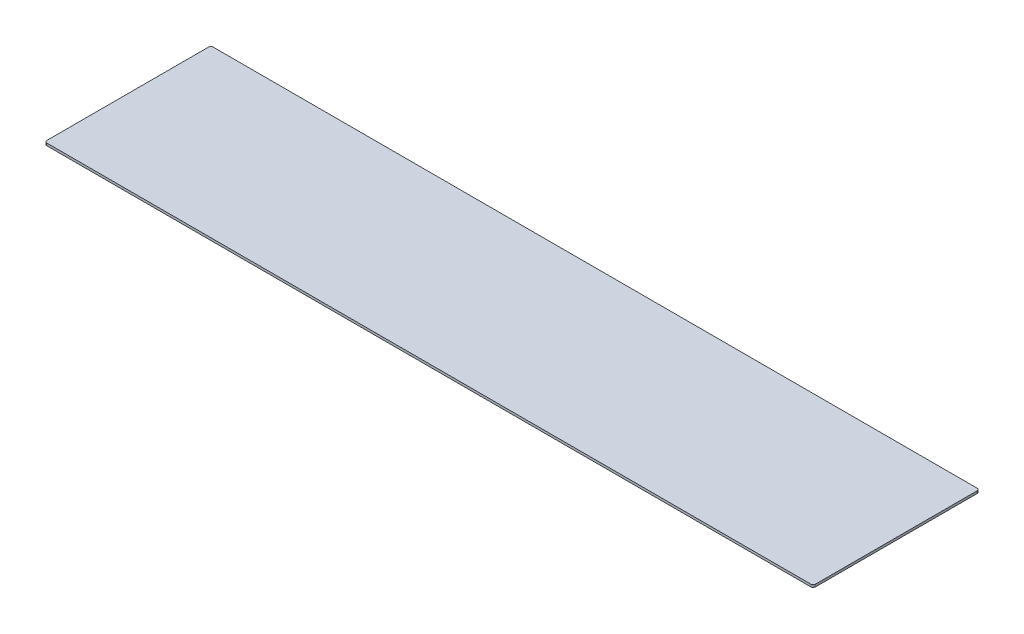
ISO-10303-21;
HEADER;
FILE_DESCRIPTION(('STEP AP214'),'2;1');
FILE_NAME('part.step','',(''),(''),'','','');
FILE_SCHEMA(('AUTOMOTIVE_DESIGN { 1 0 10303 214 1 1 1 1 }'));
ENDSEC;
DATA;
#1=APPLICATION_CONTEXT('core data for automotive mechanical design processes');
#2=APPLICATION_PROTOCOL_DEFINITION('international standard','automotive_design',2000,#1);
#3=PRODUCT_CONTEXT('',#1,'mechanical');
#4=PRODUCT('Part','Part','',(#3));
#5=PRODUCT_RELATED_PRODUCT_CATEGORY('part','',(#4));
#6=PRODUCT_DEFINITION_FORMATION('','',#4);
#7=PRODUCT_DEFINITION_CONTEXT('part definition',#1,'design');
#8=PRODUCT_DEFINITION('design','',#6,#7);
#9=PRODUCT_DEFINITION_SHAPE('','',#8);
#10=(LENGTH_UNIT() NAMED_UNIT(*) SI_UNIT(.MILLI.,.METRE.));
#11=(NAMED_UNIT(*) PLANE_ANGLE_UNIT() SI_UNIT($,.RADIAN.));
#12=(NAMED_UNIT(*) SI_UNIT($,.STERADIAN.) SOLID_ANGLE_UNIT());
#13=UNCERTAINTY_MEASURE_WITH_UNIT(LENGTH_MEASURE(1.E-05),#10,'distance_accuracy_value','');
#14=(GEOMETRIC_REPRESENTATION_CONTEXT(3) GLOBAL_UNCERTAINTY_ASSIGNED_CONTEXT((#13)) GLOBAL_UNIT_ASSIGNED_CONTEXT((#10,
#11,#12)) REPRESENTATION_CONTEXT('',''));
#15=CARTESIAN_POINT('',(0.,0.,0.));
#16=DIRECTION('',(0.,0.,1.));
#17=DIRECTION('',(1.,0.,0.));
#18=AXIS2_PLACEMENT_3D('',#15,#16,#17);
#19=CARTESIAN_POINT('',(-1595.,10.,345.));
#20=DIRECTION('',(1.,0.,0.));
#21=DIRECTION('',(0.,0.,-1.));
#22=AXIS2_PLACEMENT_3D('',#19,#20,#21);
#23=PLANE('',#22);
#24=DIRECTION('',(0.,0.,1.));
#25=VECTOR('',#24,1.);
#26=CARTESIAN_POINT('',(-1595.,10.,345.));
#27=LINE('',#26,#25);
#28=CARTESIAN_POINT('',(-1595.,10.,-335.));
#29=VERTEX_POINT('',#28);
#30=CARTESIAN_POINT('',(-1595.,10.,335.));
#31=VERTEX_POINT('',#30);
#32=EDGE_CURVE('E115',#29,#31,#27,.T.);
#33=ORIENTED_EDGE('',*,*,#32,.F.);
#34=DIRECTION('',(0.,-1.,0.));
#35=VECTOR('',#34,1.);
#36=CARTESIAN_POINT('',(-1595.,10.,-335.));
#37=LINE('',#36,#35);
#38=CARTESIAN_POINT('',(-1595.,0.,-335.));
#39=VERTEX_POINT('',#38);
#40=EDGE_CURVE('E100',#29,#39,#37,.T.);
#41=ORIENTED_EDGE('',*,*,#40,.T.);
#42=DIRECTION('',(0.,0.,1.));
#43=VECTOR('',#42,1.);
#44=CARTESIAN_POINT('',(-1595.,0.,345.));
#45=LINE('',#44,#43);
#46=CARTESIAN_POINT('',(-1595.,0.,335.));
#47=VERTEX_POINT('',#46);
#48=EDGE_CURVE('E112',#39,#47,#45,.T.);
#49=ORIENTED_EDGE('',*,*,#48,.T.);
#50=DIRECTION('',(0.,-1.,0.));
#51=VECTOR('',#50,1.);
#52=CARTESIAN_POINT('',(-1595.,10.,335.));
#53=LINE('',#52,#51);
#54=EDGE_CURVE('E117',#47,#31,#53,.F.);
#55=ORIENTED_EDGE('',*,*,#54,.T.);
#56=EDGE_LOOP('',(#33,#41,#49,#55));
#57=FACE_BOUND('',#56,.T.);
#58=ADVANCED_FACE('F30',(#57),#23,.F.);
#59=CARTESIAN_POINT('',(1595.,10.,345.));
#60=DIRECTION('',(0.,0.,-1.));
#61=DIRECTION('',(-1.,0.,0.));
#62=AXIS2_PLACEMENT_3D('',#59,#60,#61);
#63=PLANE('',#62);
#64=DIRECTION('',(1.,0.,0.));
#65=VECTOR('',#64,1.);
#66=CARTESIAN_POINT('',(1595.,0.,345.));
#67=LINE('',#66,#65);
#68=CARTESIAN_POINT('',(-1585.,0.,345.));
#69=VERTEX_POINT('',#68);
#70=CARTESIAN_POINT('',(1585.,0.,345.));
#71=VERTEX_POINT('',#70);
#72=EDGE_CURVE('E121',#69,#71,#67,.T.);
#73=ORIENTED_EDGE('',*,*,#72,.T.);
#74=DIRECTION('',(0.,-1.,0.));
#75=VECTOR('',#74,1.);
#76=CARTESIAN_POINT('',(1585.,10.,345.));
#77=LINE('',#76,#75);
#78=CARTESIAN_POINT('',(1585.,10.,345.));
#79=VERTEX_POINT('',#78);
#80=EDGE_CURVE('E11',#71,#79,#77,.F.);
#81=ORIENTED_EDGE('',*,*,#80,.T.);
#82=DIRECTION('',(1.,0.,0.));
#83=VECTOR('',#82,1.);
#84=CARTESIAN_POINT('',(1595.,10.,345.));
#85=LINE('',#84,#83);
#86=CARTESIAN_POINT('',(-1585.,10.,345.));
#87=VERTEX_POINT('',#86);
#88=EDGE_CURVE('E157',#87,#79,#85,.T.);
#89=ORIENTED_EDGE('',*,*,#88,.F.);
#90=DIRECTION('',(0.,-1.,0.));
#91=VECTOR('',#90,1.);
#92=CARTESIAN_POINT('',(-1585.,10.,345.));
#93=LINE('',#92,#91);
#94=EDGE_CURVE('E38',#87,#69,#93,.T.);
#95=ORIENTED_EDGE('',*,*,#94,.T.);
#96=EDGE_LOOP('',(#73,#81,#89,#95));
#97=FACE_BOUND('',#96,.T.);
#98=ADVANCED_FACE('F155',(#97),#63,.F.);
#99=CARTESIAN_POINT('',(1595.,10.,345.));
#100=DIRECTION('',(-1.,0.,0.));
#101=DIRECTION('',(0.,0.,1.));
#102=AXIS2_PLACEMENT_3D('',#99,#100,#101);
#103=PLANE('',#102);
#104=DIRECTION('',(0.,0.,-1.));
#105=VECTOR('',#104,1.);
#106=CARTESIAN_POINT('',(1595.,0.,345.));
#107=LINE('',#106,#105);
#108=CARTESIAN_POINT('',(1595.,0.,335.));
#109=VERTEX_POINT('',#108);
#110=CARTESIAN_POINT('',(1595.,0.,-335.));
#111=VERTEX_POINT('',#110);
#112=EDGE_CURVE('E124',#109,#111,#107,.T.);
#113=ORIENTED_EDGE('',*,*,#112,.T.);
#114=DIRECTION('',(0.,-1.,0.));
#115=VECTOR('',#114,1.);
#116=CARTESIAN_POINT('',(1595.,10.,-335.));
#117=LINE('',#116,#115);
#118=CARTESIAN_POINT('',(1595.,10.,-335.));
#119=VERTEX_POINT('',#118);
#120=EDGE_CURVE('E45',#111,#119,#117,.F.);
#121=ORIENTED_EDGE('',*,*,#120,.T.);
#122=DIRECTION('',(0.,0.,-1.));
#123=VECTOR('',#122,1.);
#124=CARTESIAN_POINT('',(1595.,10.,345.));
#125=LINE('',#124,#123);
#126=CARTESIAN_POINT('',(1595.,10.,335.));
#127=VERTEX_POINT('',#126);
#128=EDGE_CURVE('E165',#127,#119,#125,.T.);
#129=ORIENTED_EDGE('',*,*,#128,.F.);
#130=DIRECTION('',(0.,-1.,0.));
#131=VECTOR('',#130,1.);
#132=CARTESIAN_POINT('',(1595.,10.,335.));
#133=LINE('',#132,#131);
#134=EDGE_CURVE('E148',#127,#109,#133,.T.);
#135=ORIENTED_EDGE('',*,*,#134,.T.);
#136=EDGE_LOOP('',(#113,#121,#129,#135));
#137=FACE_BOUND('',#136,.T.);
#138=ADVANCED_FACE('F164',(#137),#103,.F.);
#139=CARTESIAN_POINT('',(1595.,10.,-345.));
#140=DIRECTION('',(0.,0.,1.));
#141=DIRECTION('',(1.,0.,0.));
#142=AXIS2_PLACEMENT_3D('',#139,#140,#141);
#143=PLANE('',#142);
#144=DIRECTION('',(-1.,0.,0.));
#145=VECTOR('',#144,1.);
#146=CARTESIAN_POINT('',(1595.,0.,-345.));
#147=LINE('',#146,#145);
#148=CARTESIAN_POINT('',(1585.,0.,-345.));
#149=VERTEX_POINT('',#148);
#150=CARTESIAN_POINT('',(-1585.,0.,-345.));
#151=VERTEX_POINT('',#150);
#152=EDGE_CURVE('E131',#149,#151,#147,.T.);
#153=ORIENTED_EDGE('',*,*,#152,.T.);
#154=DIRECTION('',(0.,-1.,0.));
#155=VECTOR('',#154,1.);
#156=CARTESIAN_POINT('',(-1585.,10.,-345.));
#157=LINE('',#156,#155);
#158=CARTESIAN_POINT('',(-1585.,10.,-345.));
#159=VERTEX_POINT('',#158);
#160=EDGE_CURVE('E101',#151,#159,#157,.F.);
#161=ORIENTED_EDGE('',*,*,#160,.T.);
#162=DIRECTION('',(-1.,0.,0.));
#163=VECTOR('',#162,1.);
#164=CARTESIAN_POINT('',(1595.,10.,-345.));
#165=LINE('',#164,#163);
#166=CARTESIAN_POINT('',(1585.,10.,-345.));
#167=VERTEX_POINT('',#166);
#168=EDGE_CURVE('E127',#167,#159,#165,.T.);
#169=ORIENTED_EDGE('',*,*,#168,.F.);
#170=DIRECTION('',(0.,-1.,0.));
#171=VECTOR('',#170,1.);
#172=CARTESIAN_POINT('',(1585.,10.,-345.));
#173=LINE('',#172,#171);
#174=EDGE_CURVE('E106',#167,#149,#173,.T.);
#175=ORIENTED_EDGE('',*,*,#174,.T.);
#176=EDGE_LOOP('',(#153,#161,#169,#175));
#177=FACE_BOUND('',#176,.T.);
#178=ADVANCED_FACE('F193',(#177),#143,.F.);
#179=CARTESIAN_POINT('',(-1595.,10.,-345.));
#180=DIRECTION('',(0.,1.,0.));
#181=DIRECTION('',(0.,0.,1.));
#182=AXIS2_PLACEMENT_3D('',#179,#180,#181);
#183=PLANE('',#182);
#184=ORIENTED_EDGE('',*,*,#168,.T.);
#185=CARTESIAN_POINT('',(-1585.,10.,-335.));
#186=DIRECTION('',(0.,1.,0.));
#187=DIRECTION('',(0.,0.,1.));
#188=AXIS2_PLACEMENT_3D('',#185,#186,#187);
#189=CIRCLE('',#188,10.);
#190=EDGE_CURVE('E146',#159,#29,#189,.T.);
#191=ORIENTED_EDGE('',*,*,#190,.T.);
#192=ORIENTED_EDGE('',*,*,#32,.T.);
#193=CARTESIAN_POINT('',(-1585.,10.,335.));
#194=DIRECTION('',(0.,1.,0.));
#195=DIRECTION('',(0.,0.,1.));
#196=AXIS2_PLACEMENT_3D('',#193,#194,#195);
#197=CIRCLE('',#196,10.);
#198=EDGE_CURVE('E141',#31,#87,#197,.T.);
#199=ORIENTED_EDGE('',*,*,#198,.T.);
#200=ORIENTED_EDGE('',*,*,#88,.T.);
#201=CARTESIAN_POINT('',(1585.,10.,335.));
#202=DIRECTION('',(0.,1.,0.));
#203=DIRECTION('',(0.,0.,1.));
#204=AXIS2_PLACEMENT_3D('',#201,#202,#203);
#205=CIRCLE('',#204,10.);
#206=EDGE_CURVE('E52',#79,#127,#205,.T.);
#207=ORIENTED_EDGE('',*,*,#206,.T.);
#208=ORIENTED_EDGE('',*,*,#128,.T.);
#209=CARTESIAN_POINT('',(1585.,10.,-335.));
#210=DIRECTION('',(0.,1.,0.));
#211=DIRECTION('',(0.,0.,1.));
#212=AXIS2_PLACEMENT_3D('',#209,#210,#211);
#213=CIRCLE('',#212,10.);
#214=EDGE_CURVE('E144',#119,#167,#213,.T.);
#215=ORIENTED_EDGE('',*,*,#214,.T.);
#216=EDGE_LOOP('',(#184,#191,#192,#199,#200,#207,#208,#215));
#217=FACE_BOUND('',#216,.T.);
#218=ADVANCED_FACE('F170',(#217),#183,.T.);
#219=CARTESIAN_POINT('',(-1595.,0.,-345.));
#220=DIRECTION('',(0.,1.,0.));
#221=DIRECTION('',(0.,0.,1.));
#222=AXIS2_PLACEMENT_3D('',#219,#220,#221);
#223=PLANE('',#222);
#224=ORIENTED_EDGE('',*,*,#48,.F.);
#225=CARTESIAN_POINT('',(-1585.,0.,-335.));
#226=DIRECTION('',(0.,1.,0.));
#227=DIRECTION('',(0.,0.,1.));
#228=AXIS2_PLACEMENT_3D('',#225,#226,#227);
#229=CIRCLE('',#228,10.);
#230=EDGE_CURVE('E96',#39,#151,#229,.F.);
#231=ORIENTED_EDGE('',*,*,#230,.T.);
#232=ORIENTED_EDGE('',*,*,#152,.F.);
#233=CARTESIAN_POINT('',(1585.,0.,-335.));
#234=DIRECTION('',(0.,1.,0.));
#235=DIRECTION('',(0.,0.,1.));
#236=AXIS2_PLACEMENT_3D('',#233,#234,#235);
#237=CIRCLE('',#236,10.);
#238=EDGE_CURVE('E107',#149,#111,#237,.F.);
#239=ORIENTED_EDGE('',*,*,#238,.T.);
#240=ORIENTED_EDGE('',*,*,#112,.F.);
#241=CARTESIAN_POINT('',(1585.,0.,335.));
#242=DIRECTION('',(0.,1.,0.));
#243=DIRECTION('',(0.,0.,1.));
#244=AXIS2_PLACEMENT_3D('',#241,#242,#243);
#245=CIRCLE('',#244,10.);
#246=EDGE_CURVE('E135',#109,#71,#245,.F.);
#247=ORIENTED_EDGE('',*,*,#246,.T.);
#248=ORIENTED_EDGE('',*,*,#72,.F.);
#249=CARTESIAN_POINT('',(-1585.,0.,335.));
#250=DIRECTION('',(0.,1.,0.));
#251=DIRECTION('',(0.,0.,1.));
#252=AXIS2_PLACEMENT_3D('',#249,#250,#251);
#253=CIRCLE('',#252,10.);
#254=EDGE_CURVE('E116',#69,#47,#253,.F.);
#255=ORIENTED_EDGE('',*,*,#254,.T.);
#256=EDGE_LOOP('',(#224,#231,#232,#239,#240,#247,#248,#255));
#257=FACE_BOUND('',#256,.T.);
#258=ADVANCED_FACE('F119',(#257),#223,.F.);
#259=CARTESIAN_POINT('',(-1585.,10.,-335.));
#260=DIRECTION('',(0.,-1.,0.));
#261=DIRECTION('',(0.,0.,-1.));
#262=AXIS2_PLACEMENT_3D('',#259,#260,#261);
#263=CYLINDRICAL_SURFACE('',#262,10.);
#264=ORIENTED_EDGE('',*,*,#190,.F.);
#265=ORIENTED_EDGE('',*,*,#160,.F.);
#266=ORIENTED_EDGE('',*,*,#230,.F.);
#267=ORIENTED_EDGE('',*,*,#40,.F.);
#268=EDGE_LOOP('',(#264,#265,#266,#267));
#269=FACE_BOUND('',#268,.T.);
#270=ADVANCED_FACE('F99',(#269),#263,.T.);
#271=CARTESIAN_POINT('',(1585.,10.,-335.));
#272=DIRECTION('',(0.,-1.,0.));
#273=DIRECTION('',(0.,0.,-1.));
#274=AXIS2_PLACEMENT_3D('',#271,#272,#273);
#275=CYLINDRICAL_SURFACE('',#274,10.);
#276=ORIENTED_EDGE('',*,*,#214,.F.);
#277=ORIENTED_EDGE('',*,*,#120,.F.);
#278=ORIENTED_EDGE('',*,*,#238,.F.);
#279=ORIENTED_EDGE('',*,*,#174,.F.);
#280=EDGE_LOOP('',(#276,#277,#278,#279));
#281=FACE_BOUND('',#280,.T.);
#282=ADVANCED_FACE('F175',(#281),#275,.T.);
#283=CARTESIAN_POINT('',(1585.,10.,335.));
#284=DIRECTION('',(0.,-1.,0.));
#285=DIRECTION('',(0.,0.,-1.));
#286=AXIS2_PLACEMENT_3D('',#283,#284,#285);
#287=CYLINDRICAL_SURFACE('',#286,10.);
#288=ORIENTED_EDGE('',*,*,#206,.F.);
#289=ORIENTED_EDGE('',*,*,#80,.F.);
#290=ORIENTED_EDGE('',*,*,#246,.F.);
#291=ORIENTED_EDGE('',*,*,#134,.F.);
#292=EDGE_LOOP('',(#288,#289,#290,#291));
#293=FACE_BOUND('',#292,.T.);
#294=ADVANCED_FACE('F163',(#293),#287,.T.);
#295=CARTESIAN_POINT('',(-1585.,10.,335.));
#296=DIRECTION('',(0.,-1.,0.));
#297=DIRECTION('',(0.,0.,-1.));
#298=AXIS2_PLACEMENT_3D('',#295,#296,#297);
#299=CYLINDRICAL_SURFACE('',#298,10.);
#300=ORIENTED_EDGE('',*,*,#198,.F.);
#301=ORIENTED_EDGE('',*,*,#54,.F.);
#302=ORIENTED_EDGE('',*,*,#254,.F.);
#303=ORIENTED_EDGE('',*,*,#94,.F.);
#304=EDGE_LOOP('',(#300,#301,#302,#303));
#305=FACE_BOUND('',#304,.T.);
#306=ADVANCED_FACE('F32',(#305),#299,.T.);
#307=CLOSED_SHELL('',(#58,#98,#138,#178,#218,#258,#270,#282,#294,#306));
#308=MANIFOLD_SOLID_BREP('B2',#307);
#309=ADVANCED_BREP_SHAPE_REPRESENTATION('',(#18,#308),#14);
#310=SHAPE_DEFINITION_REPRESENTATION(#9,#309);
ENDSEC;
END-ISO-10303-21;
